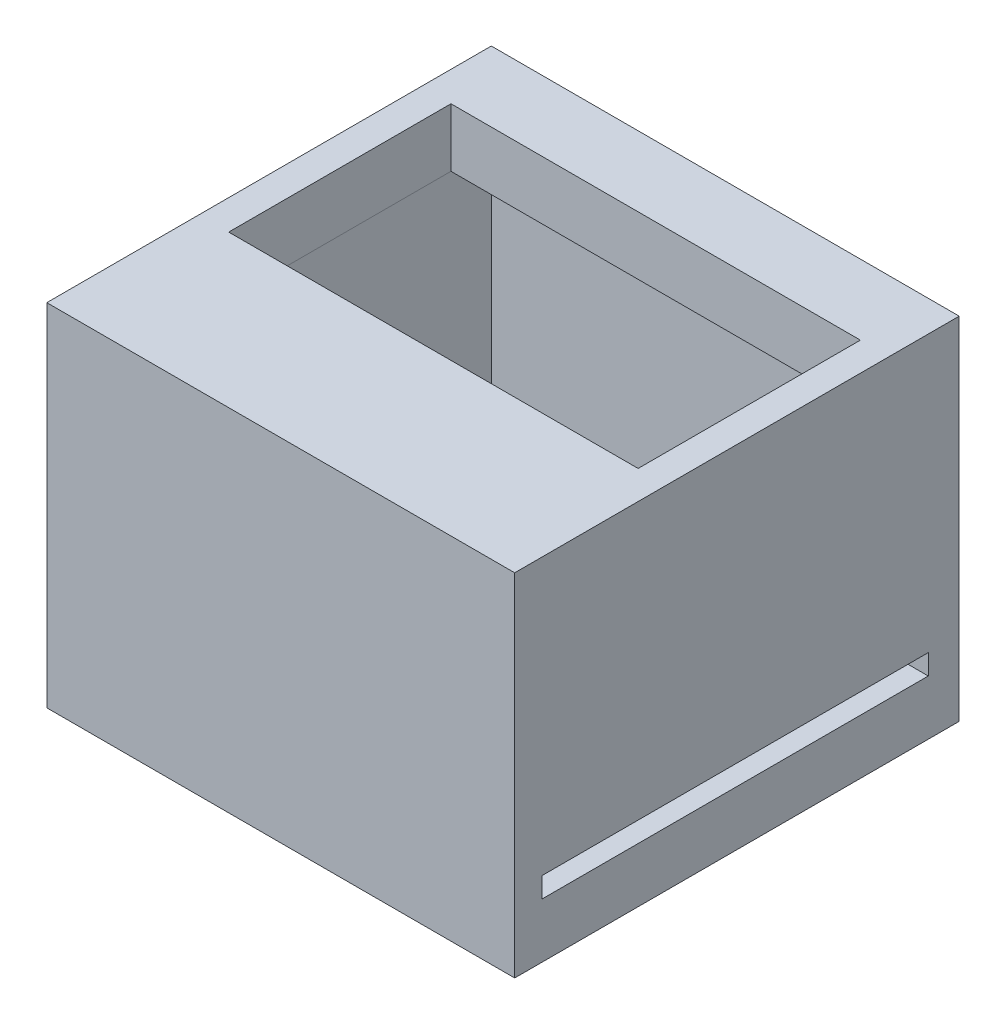
ISO-10303-21;
HEADER;
FILE_DESCRIPTION(('STEP AP214'),'2;1');
FILE_NAME('part.step','',(''),(''),'','','');
FILE_SCHEMA(('AUTOMOTIVE_DESIGN { 1 0 10303 214 1 1 1 1 }'));
ENDSEC;
DATA;
#1=APPLICATION_CONTEXT('core data for automotive mechanical design processes');
#2=APPLICATION_PROTOCOL_DEFINITION('international standard','automotive_design',2000,#1);
#3=PRODUCT_CONTEXT('',#1,'mechanical');
#4=PRODUCT('Part','Part','',(#3));
#5=PRODUCT_RELATED_PRODUCT_CATEGORY('part','',(#4));
#6=PRODUCT_DEFINITION_FORMATION('','',#4);
#7=PRODUCT_DEFINITION_CONTEXT('part definition',#1,'design');
#8=PRODUCT_DEFINITION('design','',#6,#7);
#9=PRODUCT_DEFINITION_SHAPE('','',#8);
#10=(LENGTH_UNIT() NAMED_UNIT(*) SI_UNIT(.MILLI.,.METRE.));
#11=(NAMED_UNIT(*) PLANE_ANGLE_UNIT() SI_UNIT($,.RADIAN.));
#12=(NAMED_UNIT(*) SI_UNIT($,.STERADIAN.) SOLID_ANGLE_UNIT());
#13=UNCERTAINTY_MEASURE_WITH_UNIT(LENGTH_MEASURE(1.E-05),#10,'distance_accuracy_value','');
#14=(GEOMETRIC_REPRESENTATION_CONTEXT(3) GLOBAL_UNCERTAINTY_ASSIGNED_CONTEXT((#13)) GLOBAL_UNIT_ASSIGNED_CONTEXT((#10,
#11,#12)) REPRESENTATION_CONTEXT('',''));
#15=CARTESIAN_POINT('',(0.,0.,0.));
#16=DIRECTION('',(0.,0.,1.));
#17=DIRECTION('',(1.,0.,0.));
#18=AXIS2_PLACEMENT_3D('',#15,#16,#17);
#19=CARTESIAN_POINT('',(18.2741935483871,25.,-10.0806451612903));
#20=DIRECTION('',(-1.,0.,0.));
#21=DIRECTION('',(0.,0.,1.));
#22=AXIS2_PLACEMENT_3D('',#19,#20,#21);
#23=PLANE('',#22);
#24=DIRECTION('',(0.,-1.,0.));
#25=VECTOR('',#24,1.);
#26=CARTESIAN_POINT('',(18.2741935483871,25.,12.4193548387097));
#27=LINE('',#26,#25);
#28=CARTESIAN_POINT('',(18.2741935483871,25.,12.4193548387097));
#29=VERTEX_POINT('',#28);
#30=CARTESIAN_POINT('',(18.2741935483871,6.41360642465827,12.4193548387097));
#31=VERTEX_POINT('',#30);
#32=EDGE_CURVE('E317',#29,#31,#27,.T.);
#33=ORIENTED_EDGE('',*,*,#32,.T.);
#34=DIRECTION('',(0.,0.,1.));
#35=VECTOR('',#34,1.);
#36=CARTESIAN_POINT('',(18.2741935483871,6.41360642465827,-10.0806451612903));
#37=LINE('',#36,#35);
#38=CARTESIAN_POINT('',(18.2741935483871,6.41360642465827,22.9193548387097));
#39=VERTEX_POINT('',#38);
#40=EDGE_CURVE('E265',#31,#39,#37,.T.);
#41=ORIENTED_EDGE('',*,*,#40,.T.);
#42=DIRECTION('',(0.,-1.,0.));
#43=VECTOR('',#42,1.);
#44=CARTESIAN_POINT('',(18.2741935483871,25.,22.9193548387097));
#45=LINE('',#44,#43);
#46=CARTESIAN_POINT('',(18.2741935483871,25.,22.9193548387097));
#47=VERTEX_POINT('',#46);
#48=EDGE_CURVE('E351',#47,#39,#45,.T.);
#49=ORIENTED_EDGE('',*,*,#48,.F.);
#50=DIRECTION('',(0.,0.,-1.));
#51=VECTOR('',#50,1.);
#52=CARTESIAN_POINT('',(18.2741935483871,25.,-10.0806451612903));
#53=LINE('',#52,#51);
#54=EDGE_CURVE('E328',#47,#29,#53,.T.);
#55=ORIENTED_EDGE('',*,*,#54,.T.);
#56=EDGE_LOOP('',(#33,#41,#49,#55));
#57=FACE_BOUND('',#56,.T.);
#58=ADVANCED_FACE('F35',(#57),#23,.T.);
#59=CARTESIAN_POINT('',(18.2741935483871,4.68030423613186,22.9193548387097));
#60=VERTEX_POINT('',#59);
#61=CARTESIAN_POINT('',(18.2741935483871,0.,22.9193548387097));
#62=VERTEX_POINT('',#61);
#63=EDGE_CURVE('E350',#60,#62,#45,.T.);
#64=ORIENTED_EDGE('',*,*,#63,.F.);
#65=DIRECTION('',(0.,0.,-1.));
#66=VECTOR('',#65,1.);
#67=CARTESIAN_POINT('',(18.2741935483871,4.68030423613186,-10.0806451612903));
#68=LINE('',#67,#66);
#69=CARTESIAN_POINT('',(18.2741935483871,4.68030423613186,12.4193548387097));
#70=VERTEX_POINT('',#69);
#71=EDGE_CURVE('E246',#60,#70,#68,.T.);
#72=ORIENTED_EDGE('',*,*,#71,.T.);
#73=CARTESIAN_POINT('',(18.2741935483871,0.,12.4193548387097));
#74=VERTEX_POINT('',#73);
#75=EDGE_CURVE('E316',#70,#74,#27,.T.);
#76=ORIENTED_EDGE('',*,*,#75,.T.);
#77=DIRECTION('',(0.,0.,-1.));
#78=VECTOR('',#77,1.);
#79=CARTESIAN_POINT('',(18.2741935483871,0.,-10.0806451612903));
#80=LINE('',#79,#78);
#81=EDGE_CURVE('E340',#62,#74,#80,.T.);
#82=ORIENTED_EDGE('',*,*,#81,.F.);
#83=EDGE_LOOP('',(#64,#72,#76,#82));
#84=FACE_BOUND('',#83,.T.);
#85=ADVANCED_FACE('F462',(#84),#23,.T.);
#86=CARTESIAN_POINT('',(-19.2258064516129,30.,-12.5806451612903));
#87=DIRECTION('',(1.,0.,0.));
#88=DIRECTION('',(0.,0.,-1.));
#89=AXIS2_PLACEMENT_3D('',#86,#87,#88);
#90=PLANE('',#89);
#91=DIRECTION('',(0.,0.,1.));
#92=VECTOR('',#91,1.);
#93=CARTESIAN_POINT('',(-19.2258064516129,0.,-12.5806451612903));
#94=LINE('',#93,#92);
#95=CARTESIAN_POINT('',(-19.2258064516129,0.,-12.5806451612903));
#96=VERTEX_POINT('',#95);
#97=CARTESIAN_POINT('',(-19.2258064516129,0.,25.4193548387097));
#98=VERTEX_POINT('',#97);
#99=EDGE_CURVE('E358',#96,#98,#94,.T.);
#100=ORIENTED_EDGE('',*,*,#99,.T.);
#101=DIRECTION('',(0.,-1.,0.));
#102=VECTOR('',#101,1.);
#103=CARTESIAN_POINT('',(-19.2258064516129,30.,25.4193548387097));
#104=LINE('',#103,#102);
#105=CARTESIAN_POINT('',(-19.2258064516129,30.,25.4193548387097));
#106=VERTEX_POINT('',#105);
#107=EDGE_CURVE('E385',#106,#98,#104,.T.);
#108=ORIENTED_EDGE('',*,*,#107,.F.);
#109=DIRECTION('',(0.,0.,1.));
#110=VECTOR('',#109,1.);
#111=CARTESIAN_POINT('',(-19.2258064516129,30.,-12.5806451612903));
#112=LINE('',#111,#110);
#113=CARTESIAN_POINT('',(-19.2258064516129,30.,-12.5806451612903));
#114=VERTEX_POINT('',#113);
#115=EDGE_CURVE('E359',#114,#106,#112,.T.);
#116=ORIENTED_EDGE('',*,*,#115,.F.);
#117=DIRECTION('',(0.,-1.,0.));
#118=VECTOR('',#117,1.);
#119=CARTESIAN_POINT('',(-19.2258064516129,30.,-12.5806451612903));
#120=LINE('',#119,#118);
#121=EDGE_CURVE('E369',#114,#96,#120,.T.);
#122=ORIENTED_EDGE('',*,*,#121,.T.);
#123=EDGE_LOOP('',(#100,#108,#116,#122));
#124=FACE_BOUND('',#123,.T.);
#125=DIRECTION('',(0.,0.,1.));
#126=VECTOR('',#125,1.);
#127=CARTESIAN_POINT('',(-19.2258064516129,6.41360642465827,-12.5806451612903));
#128=LINE('',#127,#126);
#129=CARTESIAN_POINT('',(-19.2258064516129,6.41360642465827,-9.93662954053454));
#130=VERTEX_POINT('',#129);
#131=CARTESIAN_POINT('',(-19.2258064516129,6.41360642465827,23.0967254104328));
#132=VERTEX_POINT('',#131);
#133=EDGE_CURVE('E50',#130,#132,#128,.T.);
#134=ORIENTED_EDGE('',*,*,#133,.T.);
#135=DIRECTION('',(0.,-1.,0.));
#136=VECTOR('',#135,1.);
#137=CARTESIAN_POINT('',(-19.2258064516129,30.,23.0967254104328));
#138=LINE('',#137,#136);
#139=CARTESIAN_POINT('',(-19.2258064516129,4.68030423613186,23.0967254104328));
#140=VERTEX_POINT('',#139);
#141=EDGE_CURVE('E218',#132,#140,#138,.T.);
#142=ORIENTED_EDGE('',*,*,#141,.T.);
#143=DIRECTION('',(0.,0.,-1.));
#144=VECTOR('',#143,1.);
#145=CARTESIAN_POINT('',(-19.2258064516129,4.68030423613186,-12.5806451612903));
#146=LINE('',#145,#144);
#147=CARTESIAN_POINT('',(-19.2258064516129,4.68030423613186,-9.93662954053454));
#148=VERTEX_POINT('',#147);
#149=EDGE_CURVE('E224',#140,#148,#146,.T.);
#150=ORIENTED_EDGE('',*,*,#149,.T.);
#151=DIRECTION('',(0.,1.,0.));
#152=VECTOR('',#151,1.);
#153=CARTESIAN_POINT('',(-19.2258064516129,30.,-9.93662954053454));
#154=LINE('',#153,#152);
#155=EDGE_CURVE('E228',#148,#130,#154,.T.);
#156=ORIENTED_EDGE('',*,*,#155,.T.);
#157=EDGE_LOOP('',(#134,#142,#150,#156));
#158=FACE_BOUND('',#157,.T.);
#159=ADVANCED_FACE('F37',(#124,#158),#90,.F.);
#160=CARTESIAN_POINT('',(20.7741935483871,30.,-12.5806451612903));
#161=DIRECTION('',(-1.,0.,0.));
#162=DIRECTION('',(0.,0.,1.));
#163=AXIS2_PLACEMENT_3D('',#160,#161,#162);
#164=PLANE('',#163);
#165=DIRECTION('',(0.,0.,-1.));
#166=VECTOR('',#165,1.);
#167=CARTESIAN_POINT('',(20.7741935483871,0.,-12.5806451612903));
#168=LINE('',#167,#166);
#169=CARTESIAN_POINT('',(20.7741935483871,0.,25.4193548387097));
#170=VERTEX_POINT('',#169);
#171=CARTESIAN_POINT('',(20.7741935483871,0.,-12.5806451612903));
#172=VERTEX_POINT('',#171);
#173=EDGE_CURVE('E374',#170,#172,#168,.T.);
#174=ORIENTED_EDGE('',*,*,#173,.T.);
#175=DIRECTION('',(0.,-1.,0.));
#176=VECTOR('',#175,1.);
#177=CARTESIAN_POINT('',(20.7741935483871,30.,-12.5806451612903));
#178=LINE('',#177,#176);
#179=CARTESIAN_POINT('',(20.7741935483871,30.,-12.5806451612903));
#180=VERTEX_POINT('',#179);
#181=EDGE_CURVE('E379',#180,#172,#178,.T.);
#182=ORIENTED_EDGE('',*,*,#181,.F.);
#183=DIRECTION('',(0.,0.,-1.));
#184=VECTOR('',#183,1.);
#185=CARTESIAN_POINT('',(20.7741935483871,30.,-12.5806451612903));
#186=LINE('',#185,#184);
#187=CARTESIAN_POINT('',(20.7741935483871,30.,25.4193548387097));
#188=VERTEX_POINT('',#187);
#189=EDGE_CURVE('E365',#188,#180,#186,.T.);
#190=ORIENTED_EDGE('',*,*,#189,.F.);
#191=DIRECTION('',(0.,-1.,0.));
#192=VECTOR('',#191,1.);
#193=CARTESIAN_POINT('',(20.7741935483871,30.,25.4193548387097));
#194=LINE('',#193,#192);
#195=EDGE_CURVE('E382',#188,#170,#194,.T.);
#196=ORIENTED_EDGE('',*,*,#195,.T.);
#197=EDGE_LOOP('',(#174,#182,#190,#196));
#198=FACE_BOUND('',#197,.T.);
#199=DIRECTION('',(0.,0.,1.));
#200=VECTOR('',#199,1.);
#201=CARTESIAN_POINT('',(20.7741935483871,6.41360642465827,-12.5806451612903));
#202=LINE('',#201,#200);
#203=CARTESIAN_POINT('',(20.7741935483871,6.41360642465827,-9.93662954053454));
#204=VERTEX_POINT('',#203);
#205=CARTESIAN_POINT('',(20.7741935483871,6.41360642465827,23.0967254104328));
#206=VERTEX_POINT('',#205);
#207=EDGE_CURVE('E211',#204,#206,#202,.T.);
#208=ORIENTED_EDGE('',*,*,#207,.F.);
#209=DIRECTION('',(0.,1.,0.));
#210=VECTOR('',#209,1.);
#211=CARTESIAN_POINT('',(20.7741935483871,30.,-9.93662954053454));
#212=LINE('',#211,#210);
#213=CARTESIAN_POINT('',(20.7741935483871,4.68030423613186,-9.93662954053454));
#214=VERTEX_POINT('',#213);
#215=EDGE_CURVE('E278',#214,#204,#212,.T.);
#216=ORIENTED_EDGE('',*,*,#215,.F.);
#217=DIRECTION('',(0.,0.,-1.));
#218=VECTOR('',#217,1.);
#219=CARTESIAN_POINT('',(20.7741935483871,4.68030423613186,-12.5806451612903));
#220=LINE('',#219,#218);
#221=CARTESIAN_POINT('',(20.7741935483871,4.68030423613186,23.0967254104328));
#222=VERTEX_POINT('',#221);
#223=EDGE_CURVE('E255',#222,#214,#220,.T.);
#224=ORIENTED_EDGE('',*,*,#223,.F.);
#225=DIRECTION('',(0.,-1.,0.));
#226=VECTOR('',#225,1.);
#227=CARTESIAN_POINT('',(20.7741935483871,30.,23.0967254104328));
#228=LINE('',#227,#226);
#229=EDGE_CURVE('E11',#206,#222,#228,.T.);
#230=ORIENTED_EDGE('',*,*,#229,.F.);
#231=EDGE_LOOP('',(#208,#216,#224,#230));
#232=FACE_BOUND('',#231,.T.);
#233=ADVANCED_FACE('F412',(#198,#232),#164,.F.);
#234=CARTESIAN_POINT('',(-16.7258064516129,25.,-10.0806451612903));
#235=DIRECTION('',(1.,0.,0.));
#236=DIRECTION('',(0.,0.,-1.));
#237=AXIS2_PLACEMENT_3D('',#234,#235,#236);
#238=PLANE('',#237);
#239=DIRECTION('',(0.,-1.,0.));
#240=VECTOR('',#239,1.);
#241=CARTESIAN_POINT('',(-16.7258064516129,25.,22.9193548387097));
#242=LINE('',#241,#240);
#243=CARTESIAN_POINT('',(-16.7258064516129,25.,22.9193548387097));
#244=VERTEX_POINT('',#243);
#245=CARTESIAN_POINT('',(-16.7258064516129,6.41360642465827,22.9193548387097));
#246=VERTEX_POINT('',#245);
#247=EDGE_CURVE('E355',#244,#246,#242,.T.);
#248=ORIENTED_EDGE('',*,*,#247,.T.);
#249=DIRECTION('',(0.,0.,-1.));
#250=VECTOR('',#249,1.);
#251=CARTESIAN_POINT('',(-16.7258064516129,6.41360642465827,-10.0806451612903));
#252=LINE('',#251,#250);
#253=CARTESIAN_POINT('',(-16.7258064516129,6.41360642465827,-9.93662954053454));
#254=VERTEX_POINT('',#253);
#255=EDGE_CURVE('E271',#246,#254,#252,.T.);
#256=ORIENTED_EDGE('',*,*,#255,.T.);
#257=DIRECTION('',(0.,-1.,0.));
#258=VECTOR('',#257,1.);
#259=CARTESIAN_POINT('',(-16.7258064516129,25.,-9.93662954053454));
#260=LINE('',#259,#258);
#261=CARTESIAN_POINT('',(-16.7258064516129,4.68030423613186,-9.93662954053454));
#262=VERTEX_POINT('',#261);
#263=EDGE_CURVE('E275',#254,#262,#260,.T.);
#264=ORIENTED_EDGE('',*,*,#263,.T.);
#265=DIRECTION('',(0.,0.,1.));
#266=VECTOR('',#265,1.);
#267=CARTESIAN_POINT('',(-16.7258064516129,4.68030423613186,-10.0806451612903));
#268=LINE('',#267,#266);
#269=CARTESIAN_POINT('',(-16.7258064516129,4.68030423613186,22.9193548387097));
#270=VERTEX_POINT('',#269);
#271=EDGE_CURVE('E252',#262,#270,#268,.T.);
#272=ORIENTED_EDGE('',*,*,#271,.T.);
#273=CARTESIAN_POINT('',(-16.7258064516129,0.,22.9193548387097));
#274=VERTEX_POINT('',#273);
#275=EDGE_CURVE('E354',#270,#274,#242,.T.);
#276=ORIENTED_EDGE('',*,*,#275,.T.);
#277=DIRECTION('',(0.,0.,1.));
#278=VECTOR('',#277,1.);
#279=CARTESIAN_POINT('',(-16.7258064516129,0.,-10.0806451612903));
#280=LINE('',#279,#278);
#281=CARTESIAN_POINT('',(-16.7258064516129,0.,-10.0806451612903));
#282=VERTEX_POINT('',#281);
#283=EDGE_CURVE('E320',#282,#274,#280,.T.);
#284=ORIENTED_EDGE('',*,*,#283,.F.);
#285=DIRECTION('',(0.,-1.,0.));
#286=VECTOR('',#285,1.);
#287=CARTESIAN_POINT('',(-16.7258064516129,25.,-10.0806451612903));
#288=LINE('',#287,#286);
#289=CARTESIAN_POINT('',(-16.7258064516129,25.,-10.0806451612903));
#290=VERTEX_POINT('',#289);
#291=EDGE_CURVE('E333',#290,#282,#288,.T.);
#292=ORIENTED_EDGE('',*,*,#291,.F.);
#293=DIRECTION('',(0.,0.,1.));
#294=VECTOR('',#293,1.);
#295=CARTESIAN_POINT('',(-16.7258064516129,25.,-10.0806451612903));
#296=LINE('',#295,#294);
#297=EDGE_CURVE('E321',#290,#244,#296,.T.);
#298=ORIENTED_EDGE('',*,*,#297,.T.);
#299=EDGE_LOOP('',(#248,#256,#264,#272,#276,#284,#292,#298));
#300=FACE_BOUND('',#299,.T.);
#301=ADVANCED_FACE('F445',(#300),#238,.T.);
#302=CARTESIAN_POINT('',(-16.7258064516129,25.,22.9193548387097));
#303=DIRECTION('',(0.,0.,-1.));
#304=DIRECTION('',(-1.,0.,0.));
#305=AXIS2_PLACEMENT_3D('',#302,#303,#304);
#306=PLANE('',#305);
#307=ORIENTED_EDGE('',*,*,#48,.T.);
#308=DIRECTION('',(-1.,0.,0.));
#309=VECTOR('',#308,1.);
#310=CARTESIAN_POINT('',(-16.7258064516129,6.41360642465827,22.9193548387097));
#311=LINE('',#310,#309);
#312=EDGE_CURVE('E268',#39,#246,#311,.T.);
#313=ORIENTED_EDGE('',*,*,#312,.T.);
#314=ORIENTED_EDGE('',*,*,#247,.F.);
#315=DIRECTION('',(1.,0.,0.));
#316=VECTOR('',#315,1.);
#317=CARTESIAN_POINT('',(-16.7258064516129,25.,22.9193548387097));
#318=LINE('',#317,#316);
#319=EDGE_CURVE('E324',#244,#47,#318,.T.);
#320=ORIENTED_EDGE('',*,*,#319,.T.);
#321=EDGE_LOOP('',(#307,#313,#314,#320));
#322=FACE_BOUND('',#321,.T.);
#323=ADVANCED_FACE('F447',(#322),#306,.T.);
#324=ORIENTED_EDGE('',*,*,#275,.F.);
#325=DIRECTION('',(1.,0.,0.));
#326=VECTOR('',#325,1.);
#327=CARTESIAN_POINT('',(-16.7258064516129,4.68030423613186,22.9193548387097));
#328=LINE('',#327,#326);
#329=EDGE_CURVE('E249',#270,#60,#328,.T.);
#330=ORIENTED_EDGE('',*,*,#329,.T.);
#331=ORIENTED_EDGE('',*,*,#63,.T.);
#332=DIRECTION('',(1.,0.,0.));
#333=VECTOR('',#332,1.);
#334=CARTESIAN_POINT('',(-16.7258064516129,0.,22.9193548387097));
#335=LINE('',#334,#333);
#336=EDGE_CURVE('E336',#274,#62,#335,.T.);
#337=ORIENTED_EDGE('',*,*,#336,.F.);
#338=EDGE_LOOP('',(#324,#330,#331,#337));
#339=FACE_BOUND('',#338,.T.);
#340=ADVANCED_FACE('F460',(#339),#306,.T.);
#341=DIRECTION('',(0.,1.,0.));
#342=VECTOR('',#341,1.);
#343=CARTESIAN_POINT('',(18.2741935483871,25.,-9.93662954053454));
#344=LINE('',#343,#342);
#345=CARTESIAN_POINT('',(18.2741935483871,4.68030423613186,-9.93662954053454));
#346=VERTEX_POINT('',#345);
#347=CARTESIAN_POINT('',(18.2741935483871,6.41360642465827,-9.93662954053454));
#348=VERTEX_POINT('',#347);
#349=EDGE_CURVE('E43',#346,#348,#344,.T.);
#350=ORIENTED_EDGE('',*,*,#349,.T.);
#351=DIRECTION('',(0.,0.,1.));
#352=VECTOR('',#351,1.);
#353=CARTESIAN_POINT('',(18.2741935483871,6.41360642465827,-10.0806451612903));
#354=LINE('',#353,#352);
#355=CARTESIAN_POINT('',(18.2741935483871,6.41360642465827,-6.58064516129032));
#356=VERTEX_POINT('',#355);
#357=EDGE_CURVE('E262',#348,#356,#354,.T.);
#358=ORIENTED_EDGE('',*,*,#357,.T.);
#359=DIRECTION('',(0.,-1.,0.));
#360=VECTOR('',#359,1.);
#361=CARTESIAN_POINT('',(18.2741935483871,25.,-6.58064516129032));
#362=LINE('',#361,#360);
#363=CARTESIAN_POINT('',(18.2741935483871,25.,-6.58064516129032));
#364=VERTEX_POINT('',#363);
#365=EDGE_CURVE('E313',#364,#356,#362,.T.);
#366=ORIENTED_EDGE('',*,*,#365,.F.);
#367=CARTESIAN_POINT('',(18.2741935483871,25.,-10.0806451612903));
#368=VERTEX_POINT('',#367);
#369=EDGE_CURVE('E327',#364,#368,#53,.T.);
#370=ORIENTED_EDGE('',*,*,#369,.T.);
#371=DIRECTION('',(0.,-1.,0.));
#372=VECTOR('',#371,1.);
#373=CARTESIAN_POINT('',(18.2741935483871,25.,-10.0806451612903));
#374=LINE('',#373,#372);
#375=CARTESIAN_POINT('',(18.2741935483871,0.,-10.0806451612903));
#376=VERTEX_POINT('',#375);
#377=EDGE_CURVE('E347',#368,#376,#374,.T.);
#378=ORIENTED_EDGE('',*,*,#377,.T.);
#379=CARTESIAN_POINT('',(18.2741935483871,0.,-6.58064516129032));
#380=VERTEX_POINT('',#379);
#381=EDGE_CURVE('E339',#380,#376,#80,.T.);
#382=ORIENTED_EDGE('',*,*,#381,.F.);
#383=CARTESIAN_POINT('',(18.2741935483871,4.68030423613186,-6.58064516129032));
#384=VERTEX_POINT('',#383);
#385=EDGE_CURVE('E312',#384,#380,#362,.T.);
#386=ORIENTED_EDGE('',*,*,#385,.F.);
#387=DIRECTION('',(0.,0.,-1.));
#388=VECTOR('',#387,1.);
#389=CARTESIAN_POINT('',(18.2741935483871,4.68030423613186,-10.0806451612903));
#390=LINE('',#389,#388);
#391=EDGE_CURVE('E243',#384,#346,#390,.T.);
#392=ORIENTED_EDGE('',*,*,#391,.T.);
#393=EDGE_LOOP('',(#350,#358,#366,#370,#378,#382,#386,#392));
#394=FACE_BOUND('',#393,.T.);
#395=ADVANCED_FACE('F401',(#394),#23,.T.);
#396=CARTESIAN_POINT('',(-16.6736574477335,30.,12.4193548387097));
#397=DIRECTION('',(0.,0.,-1.));
#398=DIRECTION('',(-1.,0.,0.));
#399=AXIS2_PLACEMENT_3D('',#396,#397,#398);
#400=PLANE('',#399);
#401=DIRECTION('',(0.,-1.,0.));
#402=VECTOR('',#401,1.);
#403=CARTESIAN_POINT('',(18.3263425522665,30.,12.4193548387097));
#404=LINE('',#403,#402);
#405=CARTESIAN_POINT('',(18.3263425522665,30.,12.4193548387097));
#406=VERTEX_POINT('',#405);
#407=CARTESIAN_POINT('',(18.3263425522665,6.41360642465827,12.4193548387097));
#408=VERTEX_POINT('',#407);
#409=EDGE_CURVE('E309',#406,#408,#404,.T.);
#410=ORIENTED_EDGE('',*,*,#409,.T.);
#411=DIRECTION('',(-1.,0.,0.));
#412=VECTOR('',#411,1.);
#413=CARTESIAN_POINT('',(-16.6736574477335,6.41360642465827,12.4193548387097));
#414=LINE('',#413,#412);
#415=EDGE_CURVE('E259',#408,#31,#414,.T.);
#416=ORIENTED_EDGE('',*,*,#415,.T.);
#417=ORIENTED_EDGE('',*,*,#32,.F.);
#418=DIRECTION('',(-1.,0.,0.));
#419=VECTOR('',#418,1.);
#420=CARTESIAN_POINT('',(0.,25.,12.4193548387097));
#421=LINE('',#420,#419);
#422=CARTESIAN_POINT('',(-16.6736574477335,25.,12.4193548387097));
#423=VERTEX_POINT('',#422);
#424=EDGE_CURVE('E393',#29,#423,#421,.T.);
#425=ORIENTED_EDGE('',*,*,#424,.T.);
#426=DIRECTION('',(0.,-1.,0.));
#427=VECTOR('',#426,1.);
#428=CARTESIAN_POINT('',(-16.6736574477335,30.,12.4193548387097));
#429=LINE('',#428,#427);
#430=CARTESIAN_POINT('',(-16.6736574477335,30.,12.4193548387097));
#431=VERTEX_POINT('',#430);
#432=EDGE_CURVE('E292',#431,#423,#429,.T.);
#433=ORIENTED_EDGE('',*,*,#432,.F.);
#434=DIRECTION('',(1.,0.,0.));
#435=VECTOR('',#434,1.);
#436=CARTESIAN_POINT('',(-16.6736574477335,30.,12.4193548387097));
#437=LINE('',#436,#435);
#438=EDGE_CURVE('E281',#431,#406,#437,.T.);
#439=ORIENTED_EDGE('',*,*,#438,.T.);
#440=EDGE_LOOP('',(#410,#416,#417,#425,#433,#439));
#441=FACE_BOUND('',#440,.T.);
#442=ADVANCED_FACE('F451',(#441),#400,.T.);
#443=ORIENTED_EDGE('',*,*,#75,.F.);
#444=DIRECTION('',(1.,0.,0.));
#445=VECTOR('',#444,1.);
#446=CARTESIAN_POINT('',(-16.6736574477335,4.68030423613186,12.4193548387097));
#447=LINE('',#446,#445);
#448=CARTESIAN_POINT('',(18.3263425522665,4.68030423613186,12.4193548387097));
#449=VERTEX_POINT('',#448);
#450=EDGE_CURVE('E240',#70,#449,#447,.T.);
#451=ORIENTED_EDGE('',*,*,#450,.T.);
#452=CARTESIAN_POINT('',(18.3263425522665,0.,12.4193548387097));
#453=VERTEX_POINT('',#452);
#454=EDGE_CURVE('E308',#449,#453,#404,.T.);
#455=ORIENTED_EDGE('',*,*,#454,.T.);
#456=DIRECTION('',(1.,0.,0.));
#457=VECTOR('',#456,1.);
#458=CARTESIAN_POINT('',(-16.6736574477335,0.,12.4193548387097));
#459=LINE('',#458,#457);
#460=EDGE_CURVE('E280',#74,#453,#459,.T.);
#461=ORIENTED_EDGE('',*,*,#460,.F.);
#462=EDGE_LOOP('',(#443,#451,#455,#461));
#463=FACE_BOUND('',#462,.T.);
#464=ADVANCED_FACE('F453',(#463),#400,.T.);
#465=CARTESIAN_POINT('',(18.3263425522665,30.,-6.58064516129032));
#466=DIRECTION('',(1.,0.,0.));
#467=DIRECTION('',(0.,0.,-1.));
#468=AXIS2_PLACEMENT_3D('',#465,#466,#467);
#469=PLANE('',#468);
#470=DIRECTION('',(0.,0.,-1.));
#471=VECTOR('',#470,1.);
#472=CARTESIAN_POINT('',(18.3263425522665,6.41360642465827,-6.58064516129032));
#473=LINE('',#472,#471);
#474=CARTESIAN_POINT('',(18.3263425522665,6.41360642465827,-6.58064516129032));
#475=VERTEX_POINT('',#474);
#476=EDGE_CURVE('E257',#408,#475,#473,.T.);
#477=ORIENTED_EDGE('',*,*,#476,.F.);
#478=ORIENTED_EDGE('',*,*,#409,.F.);
#479=DIRECTION('',(0.,0.,1.));
#480=VECTOR('',#479,1.);
#481=CARTESIAN_POINT('',(18.3263425522665,30.,-6.58064516129032));
#482=LINE('',#481,#480);
#483=CARTESIAN_POINT('',(18.3263425522665,30.,-6.58064516129032));
#484=VERTEX_POINT('',#483);
#485=EDGE_CURVE('E283',#484,#406,#482,.T.);
#486=ORIENTED_EDGE('',*,*,#485,.F.);
#487=DIRECTION('',(0.,-1.,0.));
#488=VECTOR('',#487,1.);
#489=CARTESIAN_POINT('',(18.3263425522665,30.,-6.58064516129032));
#490=LINE('',#489,#488);
#491=EDGE_CURVE('E305',#484,#475,#490,.T.);
#492=ORIENTED_EDGE('',*,*,#491,.T.);
#493=EDGE_LOOP('',(#477,#478,#486,#492));
#494=FACE_BOUND('',#493,.T.);
#495=ADVANCED_FACE('F419',(#494),#469,.F.);
#496=DIRECTION('',(0.,0.,1.));
#497=VECTOR('',#496,1.);
#498=CARTESIAN_POINT('',(18.3263425522665,4.68030423613186,-6.58064516129032));
#499=LINE('',#498,#497);
#500=CARTESIAN_POINT('',(18.3263425522665,4.68030423613186,-6.58064516129032));
#501=VERTEX_POINT('',#500);
#502=EDGE_CURVE('E214',#501,#449,#499,.T.);
#503=ORIENTED_EDGE('',*,*,#502,.F.);
#504=CARTESIAN_POINT('',(18.3263425522665,0.,-6.58064516129032));
#505=VERTEX_POINT('',#504);
#506=EDGE_CURVE('E304',#501,#505,#490,.T.);
#507=ORIENTED_EDGE('',*,*,#506,.T.);
#508=DIRECTION('',(0.,0.,1.));
#509=VECTOR('',#508,1.);
#510=CARTESIAN_POINT('',(18.3263425522665,0.,-6.58064516129032));
#511=LINE('',#510,#509);
#512=EDGE_CURVE('E295',#505,#453,#511,.T.);
#513=ORIENTED_EDGE('',*,*,#512,.T.);
#514=ORIENTED_EDGE('',*,*,#454,.F.);
#515=EDGE_LOOP('',(#503,#507,#513,#514));
#516=FACE_BOUND('',#515,.T.);
#517=ADVANCED_FACE('F561',(#516),#469,.F.);
#518=CARTESIAN_POINT('',(-16.6736574477335,30.,-6.58064516129032));
#519=DIRECTION('',(0.,0.,-1.));
#520=DIRECTION('',(-1.,0.,0.));
#521=AXIS2_PLACEMENT_3D('',#518,#519,#520);
#522=PLANE('',#521);
#523=DIRECTION('',(-1.,0.,0.));
#524=VECTOR('',#523,1.);
#525=CARTESIAN_POINT('',(-16.6736574477335,6.41360642465827,-6.58064516129032));
#526=LINE('',#525,#524);
#527=EDGE_CURVE('E398',#475,#356,#526,.T.);
#528=ORIENTED_EDGE('',*,*,#527,.F.);
#529=ORIENTED_EDGE('',*,*,#491,.F.);
#530=DIRECTION('',(1.,0.,0.));
#531=VECTOR('',#530,1.);
#532=CARTESIAN_POINT('',(-16.6736574477335,30.,-6.58064516129032));
#533=LINE('',#532,#531);
#534=CARTESIAN_POINT('',(-16.6736574477335,30.,-6.58064516129032));
#535=VERTEX_POINT('',#534);
#536=EDGE_CURVE('E287',#535,#484,#533,.T.);
#537=ORIENTED_EDGE('',*,*,#536,.F.);
#538=DIRECTION('',(0.,-1.,0.));
#539=VECTOR('',#538,1.);
#540=CARTESIAN_POINT('',(-16.6736574477335,30.,-6.58064516129032));
#541=LINE('',#540,#539);
#542=CARTESIAN_POINT('',(-16.6736574477335,25.,-6.58064516129032));
#543=VERTEX_POINT('',#542);
#544=EDGE_CURVE('E301',#535,#543,#541,.T.);
#545=ORIENTED_EDGE('',*,*,#544,.T.);
#546=DIRECTION('',(-1.,0.,0.));
#547=VECTOR('',#546,1.);
#548=CARTESIAN_POINT('',(0.,25.,-6.58064516129032));
#549=LINE('',#548,#547);
#550=EDGE_CURVE('E390',#364,#543,#549,.T.);
#551=ORIENTED_EDGE('',*,*,#550,.F.);
#552=ORIENTED_EDGE('',*,*,#365,.T.);
#553=EDGE_LOOP('',(#528,#529,#537,#545,#551,#552));
#554=FACE_BOUND('',#553,.T.);
#555=ADVANCED_FACE('F416',(#554),#522,.F.);
#556=DIRECTION('',(1.,0.,0.));
#557=VECTOR('',#556,1.);
#558=CARTESIAN_POINT('',(-16.6736574477335,4.68030423613186,-6.58064516129032));
#559=LINE('',#558,#557);
#560=EDGE_CURVE('E396',#384,#501,#559,.T.);
#561=ORIENTED_EDGE('',*,*,#560,.F.);
#562=ORIENTED_EDGE('',*,*,#385,.T.);
#563=DIRECTION('',(1.,0.,0.));
#564=VECTOR('',#563,1.);
#565=CARTESIAN_POINT('',(-16.6736574477335,0.,-6.58064516129032));
#566=LINE('',#565,#564);
#567=EDGE_CURVE('E284',#380,#505,#566,.T.);
#568=ORIENTED_EDGE('',*,*,#567,.T.);
#569=ORIENTED_EDGE('',*,*,#506,.F.);
#570=EDGE_LOOP('',(#561,#562,#568,#569));
#571=FACE_BOUND('',#570,.T.);
#572=ADVANCED_FACE('F483',(#571),#522,.F.);
#573=CARTESIAN_POINT('',(0.,0.,0.));
#574=DIRECTION('',(0.,1.,0.));
#575=DIRECTION('',(0.,0.,1.));
#576=AXIS2_PLACEMENT_3D('',#573,#574,#575);
#577=PLANE('',#576);
#578=ORIENTED_EDGE('',*,*,#99,.F.);
#579=DIRECTION('',(-1.,0.,0.));
#580=VECTOR('',#579,1.);
#581=CARTESIAN_POINT('',(-19.2258064516129,0.,-12.5806451612903));
#582=LINE('',#581,#580);
#583=EDGE_CURVE('E363',#172,#96,#582,.T.);
#584=ORIENTED_EDGE('',*,*,#583,.F.);
#585=ORIENTED_EDGE('',*,*,#173,.F.);
#586=DIRECTION('',(1.,0.,0.));
#587=VECTOR('',#586,1.);
#588=CARTESIAN_POINT('',(-19.2258064516129,0.,25.4193548387097));
#589=LINE('',#588,#587);
#590=EDGE_CURVE('E372',#98,#170,#589,.T.);
#591=ORIENTED_EDGE('',*,*,#590,.F.);
#592=EDGE_LOOP('',(#578,#584,#585,#591));
#593=FACE_BOUND('',#592,.T.);
#594=ORIENTED_EDGE('',*,*,#460,.T.);
#595=ORIENTED_EDGE('',*,*,#512,.F.);
#596=ORIENTED_EDGE('',*,*,#567,.F.);
#597=ORIENTED_EDGE('',*,*,#381,.T.);
#598=DIRECTION('',(-1.,0.,0.));
#599=VECTOR('',#598,1.);
#600=CARTESIAN_POINT('',(-16.7258064516129,0.,-10.0806451612903));
#601=LINE('',#600,#599);
#602=EDGE_CURVE('E325',#376,#282,#601,.T.);
#603=ORIENTED_EDGE('',*,*,#602,.T.);
#604=ORIENTED_EDGE('',*,*,#283,.T.);
#605=ORIENTED_EDGE('',*,*,#336,.T.);
#606=ORIENTED_EDGE('',*,*,#81,.T.);
#607=EDGE_LOOP('',(#594,#595,#596,#597,#603,#604,#605,#606));
#608=FACE_BOUND('',#607,.T.);
#609=ADVANCED_FACE('F479',(#593,#608),#577,.F.);
#610=CARTESIAN_POINT('',(0.,30.,0.));
#611=DIRECTION('',(0.,1.,0.));
#612=DIRECTION('',(0.,0.,1.));
#613=AXIS2_PLACEMENT_3D('',#610,#611,#612);
#614=PLANE('',#613);
#615=ORIENTED_EDGE('',*,*,#115,.T.);
#616=DIRECTION('',(1.,0.,0.));
#617=VECTOR('',#616,1.);
#618=CARTESIAN_POINT('',(-19.2258064516129,30.,25.4193548387097));
#619=LINE('',#618,#617);
#620=EDGE_CURVE('E362',#106,#188,#619,.T.);
#621=ORIENTED_EDGE('',*,*,#620,.T.);
#622=ORIENTED_EDGE('',*,*,#189,.T.);
#623=DIRECTION('',(-1.,0.,0.));
#624=VECTOR('',#623,1.);
#625=CARTESIAN_POINT('',(-19.2258064516129,30.,-12.5806451612903));
#626=LINE('',#625,#624);
#627=EDGE_CURVE('E367',#180,#114,#626,.T.);
#628=ORIENTED_EDGE('',*,*,#627,.T.);
#629=EDGE_LOOP('',(#615,#621,#622,#628));
#630=FACE_BOUND('',#629,.T.);
#631=ORIENTED_EDGE('',*,*,#485,.T.);
#632=ORIENTED_EDGE('',*,*,#438,.F.);
#633=DIRECTION('',(0.,0.,1.));
#634=VECTOR('',#633,1.);
#635=CARTESIAN_POINT('',(-16.6736574477335,30.,-6.58064516129032));
#636=LINE('',#635,#634);
#637=EDGE_CURVE('E290',#535,#431,#636,.T.);
#638=ORIENTED_EDGE('',*,*,#637,.F.);
#639=ORIENTED_EDGE('',*,*,#536,.T.);
#640=EDGE_LOOP('',(#631,#632,#638,#639));
#641=FACE_BOUND('',#640,.T.);
#642=ADVANCED_FACE('F424',(#630,#641),#614,.T.);
#643=CARTESIAN_POINT('',(0.,25.,0.));
#644=DIRECTION('',(0.,1.,0.));
#645=DIRECTION('',(0.,0.,1.));
#646=AXIS2_PLACEMENT_3D('',#643,#644,#645);
#647=PLANE('',#646);
#648=ORIENTED_EDGE('',*,*,#424,.F.);
#649=ORIENTED_EDGE('',*,*,#54,.F.);
#650=ORIENTED_EDGE('',*,*,#319,.F.);
#651=ORIENTED_EDGE('',*,*,#297,.F.);
#652=DIRECTION('',(-1.,0.,0.));
#653=VECTOR('',#652,1.);
#654=CARTESIAN_POINT('',(-16.7258064516129,25.,-10.0806451612903));
#655=LINE('',#654,#653);
#656=EDGE_CURVE('E331',#368,#290,#655,.T.);
#657=ORIENTED_EDGE('',*,*,#656,.F.);
#658=ORIENTED_EDGE('',*,*,#369,.F.);
#659=ORIENTED_EDGE('',*,*,#550,.T.);
#660=DIRECTION('',(0.,0.,-1.));
#661=VECTOR('',#660,1.);
#662=CARTESIAN_POINT('',(-16.6736574477335,25.,0.));
#663=LINE('',#662,#661);
#664=EDGE_CURVE('E388',#423,#543,#663,.T.);
#665=ORIENTED_EDGE('',*,*,#664,.F.);
#666=EDGE_LOOP('',(#648,#649,#650,#651,#657,#658,#659,#665));
#667=FACE_BOUND('',#666,.T.);
#668=ADVANCED_FACE('F432',(#667),#647,.F.);
#669=CARTESIAN_POINT('',(-19.2258064516129,30.,25.4193548387097));
#670=DIRECTION('',(0.,0.,-1.));
#671=DIRECTION('',(-1.,0.,0.));
#672=AXIS2_PLACEMENT_3D('',#669,#670,#671);
#673=PLANE('',#672);
#674=ORIENTED_EDGE('',*,*,#590,.T.);
#675=ORIENTED_EDGE('',*,*,#195,.F.);
#676=ORIENTED_EDGE('',*,*,#620,.F.);
#677=ORIENTED_EDGE('',*,*,#107,.T.);
#678=EDGE_LOOP('',(#674,#675,#676,#677));
#679=FACE_BOUND('',#678,.T.);
#680=ADVANCED_FACE('F488',(#679),#673,.F.);
#681=CARTESIAN_POINT('',(-19.2258064516129,30.,-12.5806451612903));
#682=DIRECTION('',(0.,0.,1.));
#683=DIRECTION('',(1.,0.,0.));
#684=AXIS2_PLACEMENT_3D('',#681,#682,#683);
#685=PLANE('',#684);
#686=ORIENTED_EDGE('',*,*,#583,.T.);
#687=ORIENTED_EDGE('',*,*,#121,.F.);
#688=ORIENTED_EDGE('',*,*,#627,.F.);
#689=ORIENTED_EDGE('',*,*,#181,.T.);
#690=EDGE_LOOP('',(#686,#687,#688,#689));
#691=FACE_BOUND('',#690,.T.);
#692=ADVANCED_FACE('F485',(#691),#685,.F.);
#693=CARTESIAN_POINT('',(-16.7258064516129,25.,-10.0806451612903));
#694=DIRECTION('',(0.,0.,1.));
#695=DIRECTION('',(1.,0.,0.));
#696=AXIS2_PLACEMENT_3D('',#693,#694,#695);
#697=PLANE('',#696);
#698=ORIENTED_EDGE('',*,*,#602,.F.);
#699=ORIENTED_EDGE('',*,*,#377,.F.);
#700=ORIENTED_EDGE('',*,*,#656,.T.);
#701=ORIENTED_EDGE('',*,*,#291,.T.);
#702=EDGE_LOOP('',(#698,#699,#700,#701));
#703=FACE_BOUND('',#702,.T.);
#704=ADVANCED_FACE('F440',(#703),#697,.T.);
#705=CARTESIAN_POINT('',(-16.6736574477335,30.,-6.58064516129032));
#706=DIRECTION('',(1.,0.,0.));
#707=DIRECTION('',(0.,0.,-1.));
#708=AXIS2_PLACEMENT_3D('',#705,#706,#707);
#709=PLANE('',#708);
#710=ORIENTED_EDGE('',*,*,#664,.T.);
#711=ORIENTED_EDGE('',*,*,#544,.F.);
#712=ORIENTED_EDGE('',*,*,#637,.T.);
#713=ORIENTED_EDGE('',*,*,#432,.T.);
#714=EDGE_LOOP('',(#710,#711,#712,#713));
#715=FACE_BOUND('',#714,.T.);
#716=ADVANCED_FACE('F427',(#715),#709,.T.);
#717=CARTESIAN_POINT('',(80.7741935483871,30.,23.0967254104328));
#718=DIRECTION('',(0.,0.,-1.));
#719=DIRECTION('',(-1.,0.,0.));
#720=AXIS2_PLACEMENT_3D('',#717,#718,#719);
#721=PLANE('',#720);
#722=ORIENTED_EDGE('',*,*,#229,.T.);
#723=DIRECTION('',(-1.,0.,0.));
#724=VECTOR('',#723,1.);
#725=CARTESIAN_POINT('',(80.7741935483871,4.68030423613186,23.0967254104328));
#726=LINE('',#725,#724);
#727=EDGE_CURVE('E215',#222,#140,#726,.T.);
#728=ORIENTED_EDGE('',*,*,#727,.T.);
#729=ORIENTED_EDGE('',*,*,#141,.F.);
#730=DIRECTION('',(-1.,0.,0.));
#731=VECTOR('',#730,1.);
#732=CARTESIAN_POINT('',(80.7741935483871,6.41360642465827,23.0967254104328));
#733=LINE('',#732,#731);
#734=EDGE_CURVE('E206',#206,#132,#733,.T.);
#735=ORIENTED_EDGE('',*,*,#734,.F.);
#736=EDGE_LOOP('',(#722,#728,#729,#735));
#737=FACE_BOUND('',#736,.T.);
#738=ADVANCED_FACE('F219',(#737),#721,.T.);
#739=CARTESIAN_POINT('',(80.7741935483871,30.,-9.93662954053454));
#740=DIRECTION('',(0.,0.,1.));
#741=DIRECTION('',(1.,0.,0.));
#742=AXIS2_PLACEMENT_3D('',#739,#740,#741);
#743=PLANE('',#742);
#744=ORIENTED_EDGE('',*,*,#215,.T.);
#745=DIRECTION('',(-1.,0.,0.));
#746=VECTOR('',#745,1.);
#747=CARTESIAN_POINT('',(80.7741935483871,6.41360642465827,-9.93662954053454));
#748=LINE('',#747,#746);
#749=EDGE_CURVE('E235',#204,#348,#748,.T.);
#750=ORIENTED_EDGE('',*,*,#749,.T.);
#751=ORIENTED_EDGE('',*,*,#349,.F.);
#752=DIRECTION('',(-1.,0.,0.));
#753=VECTOR('',#752,1.);
#754=CARTESIAN_POINT('',(80.7741935483871,4.68030423613186,-9.93662954053454));
#755=LINE('',#754,#753);
#756=EDGE_CURVE('E58',#214,#346,#755,.T.);
#757=ORIENTED_EDGE('',*,*,#756,.F.);
#758=EDGE_LOOP('',(#744,#750,#751,#757));
#759=FACE_BOUND('',#758,.T.);
#760=ADVANCED_FACE('F405',(#759),#743,.T.);
#761=EDGE_CURVE('E233',#254,#130,#748,.T.);
#762=ORIENTED_EDGE('',*,*,#761,.T.);
#763=ORIENTED_EDGE('',*,*,#155,.F.);
#764=EDGE_CURVE('E236',#262,#148,#755,.T.);
#765=ORIENTED_EDGE('',*,*,#764,.F.);
#766=ORIENTED_EDGE('',*,*,#263,.F.);
#767=EDGE_LOOP('',(#762,#763,#765,#766));
#768=FACE_BOUND('',#767,.T.);
#769=ADVANCED_FACE('F634',(#768),#743,.T.);
#770=CARTESIAN_POINT('',(80.7741935483871,6.41360642465827,-12.5806451612903));
#771=DIRECTION('',(0.,-1.,0.));
#772=DIRECTION('',(0.,0.,-1.));
#773=AXIS2_PLACEMENT_3D('',#770,#771,#772);
#774=PLANE('',#773);
#775=ORIENTED_EDGE('',*,*,#207,.T.);
#776=ORIENTED_EDGE('',*,*,#734,.T.);
#777=ORIENTED_EDGE('',*,*,#133,.F.);
#778=ORIENTED_EDGE('',*,*,#761,.F.);
#779=ORIENTED_EDGE('',*,*,#255,.F.);
#780=ORIENTED_EDGE('',*,*,#312,.F.);
#781=ORIENTED_EDGE('',*,*,#40,.F.);
#782=ORIENTED_EDGE('',*,*,#415,.F.);
#783=ORIENTED_EDGE('',*,*,#476,.T.);
#784=ORIENTED_EDGE('',*,*,#527,.T.);
#785=ORIENTED_EDGE('',*,*,#357,.F.);
#786=ORIENTED_EDGE('',*,*,#749,.F.);
#787=EDGE_LOOP('',(#775,#776,#777,#778,#779,#780,#781,#782,#783,#784,#785,#786));
#788=FACE_BOUND('',#787,.T.);
#789=ADVANCED_FACE('F208',(#788),#774,.T.);
#790=CARTESIAN_POINT('',(80.7741935483871,4.68030423613186,-12.5806451612903));
#791=DIRECTION('',(0.,1.,0.));
#792=DIRECTION('',(0.,0.,1.));
#793=AXIS2_PLACEMENT_3D('',#790,#791,#792);
#794=PLANE('',#793);
#795=ORIENTED_EDGE('',*,*,#223,.T.);
#796=ORIENTED_EDGE('',*,*,#756,.T.);
#797=ORIENTED_EDGE('',*,*,#391,.F.);
#798=ORIENTED_EDGE('',*,*,#560,.T.);
#799=ORIENTED_EDGE('',*,*,#502,.T.);
#800=ORIENTED_EDGE('',*,*,#450,.F.);
#801=ORIENTED_EDGE('',*,*,#71,.F.);
#802=ORIENTED_EDGE('',*,*,#329,.F.);
#803=ORIENTED_EDGE('',*,*,#271,.F.);
#804=ORIENTED_EDGE('',*,*,#764,.T.);
#805=ORIENTED_EDGE('',*,*,#149,.F.);
#806=ORIENTED_EDGE('',*,*,#727,.F.);
#807=EDGE_LOOP('',(#795,#796,#797,#798,#799,#800,#801,#802,#803,#804,#805,#806));
#808=FACE_BOUND('',#807,.T.);
#809=ADVANCED_FACE('F407',(#808),#794,.T.);
#810=CLOSED_SHELL('',(#58,#85,#159,#233,#301,#323,#340,#395,#442,#464,#495,#517,#555,#572,#609,
#642,#668,#680,#692,#704,#716,#738,#760,#769,#789,#809));
#811=MANIFOLD_SOLID_BREP('B2',#810);
#812=ADVANCED_BREP_SHAPE_REPRESENTATION('',(#18,#811),#14);
#813=SHAPE_DEFINITION_REPRESENTATION(#9,#812);
ENDSEC;
END-ISO-10303-21;
